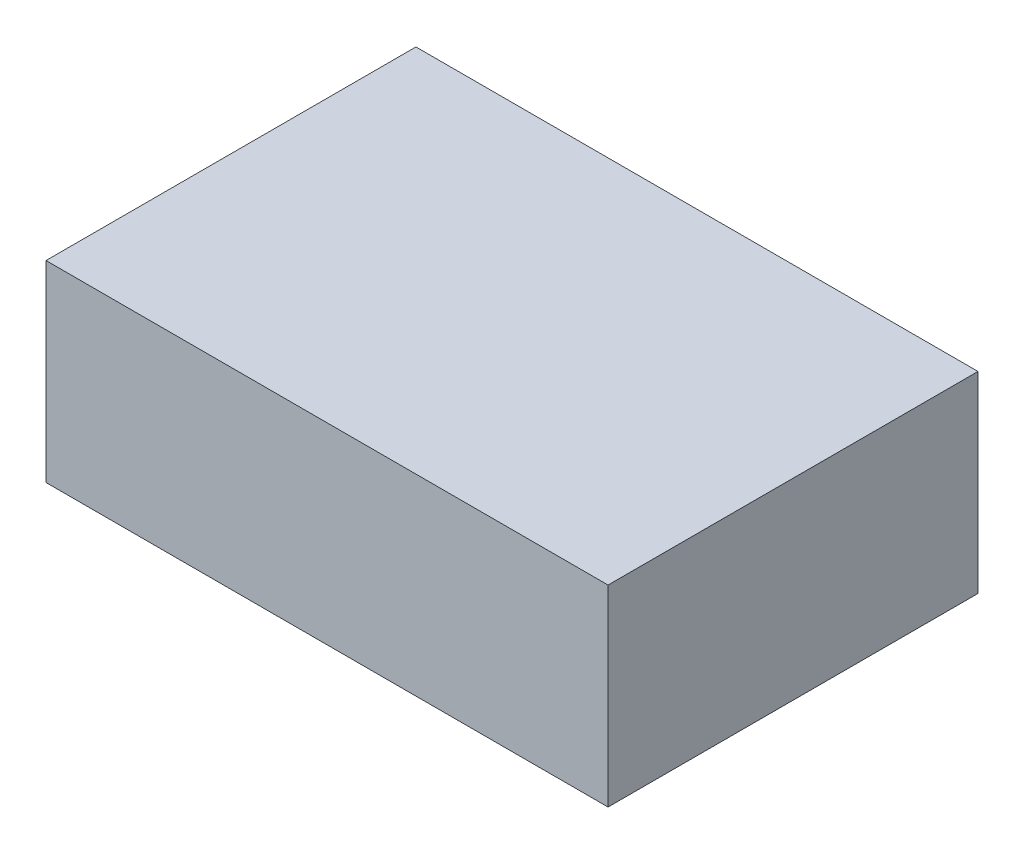
ISO-10303-21;
HEADER;
FILE_DESCRIPTION(('STEP AP214'),'2;1');
FILE_NAME('part.step','',(''),(''),'','','');
FILE_SCHEMA(('AUTOMOTIVE_DESIGN { 1 0 10303 214 1 1 1 1 }'));
ENDSEC;
DATA;
#1=APPLICATION_CONTEXT('core data for automotive mechanical design processes');
#2=APPLICATION_PROTOCOL_DEFINITION('international standard','automotive_design',2000,#1);
#3=PRODUCT_CONTEXT('',#1,'mechanical');
#4=PRODUCT('Part','Part','',(#3));
#5=PRODUCT_RELATED_PRODUCT_CATEGORY('part','',(#4));
#6=PRODUCT_DEFINITION_FORMATION('','',#4);
#7=PRODUCT_DEFINITION_CONTEXT('part definition',#1,'design');
#8=PRODUCT_DEFINITION('design','',#6,#7);
#9=PRODUCT_DEFINITION_SHAPE('','',#8);
#10=(LENGTH_UNIT() NAMED_UNIT(*) SI_UNIT(.MILLI.,.METRE.));
#11=(NAMED_UNIT(*) PLANE_ANGLE_UNIT() SI_UNIT($,.RADIAN.));
#12=(NAMED_UNIT(*) SI_UNIT($,.STERADIAN.) SOLID_ANGLE_UNIT());
#13=UNCERTAINTY_MEASURE_WITH_UNIT(LENGTH_MEASURE(1.E-05),#10,'distance_accuracy_value','');
#14=(GEOMETRIC_REPRESENTATION_CONTEXT(3) GLOBAL_UNCERTAINTY_ASSIGNED_CONTEXT((#13)) GLOBAL_UNIT_ASSIGNED_CONTEXT((#10,
#11,#12)) REPRESENTATION_CONTEXT('',''));
#15=CARTESIAN_POINT('',(0.,0.,0.));
#16=DIRECTION('',(0.,0.,1.));
#17=DIRECTION('',(1.,0.,0.));
#18=AXIS2_PLACEMENT_3D('',#15,#16,#17);
#19=CARTESIAN_POINT('',(0.,0.,0.));
#20=DIRECTION('',(0.,0.,1.));
#21=DIRECTION('',(1.,0.,0.));
#22=AXIS2_PLACEMENT_3D('',#19,#20,#21);
#23=PLANE('',#22);
#24=DIRECTION('',(-1.,0.,0.));
#25=VECTOR('',#24,1.);
#26=CARTESIAN_POINT('',(1.9304,-0.6604,0.));
#27=LINE('',#26,#25);
#28=CARTESIAN_POINT('',(1.9304,-0.6604,0.));
#29=VERTEX_POINT('',#28);
#30=CARTESIAN_POINT('',(-1.9304,-0.6604,0.));
#31=VERTEX_POINT('',#30);
#32=EDGE_CURVE('E27',#29,#31,#27,.T.);
#33=ORIENTED_EDGE('',*,*,#32,.T.);
#34=DIRECTION('',(0.,1.,0.));
#35=VECTOR('',#34,1.);
#36=CARTESIAN_POINT('',(-1.9304,-0.6604,0.));
#37=LINE('',#36,#35);
#38=CARTESIAN_POINT('',(-1.9304,0.6604,0.));
#39=VERTEX_POINT('',#38);
#40=EDGE_CURVE('E20',#31,#39,#37,.T.);
#41=ORIENTED_EDGE('',*,*,#40,.T.);
#42=DIRECTION('',(1.,0.,0.));
#43=VECTOR('',#42,1.);
#44=CARTESIAN_POINT('',(-1.9304,0.6604,0.));
#45=LINE('',#44,#43);
#46=CARTESIAN_POINT('',(1.9304,0.6604,0.));
#47=VERTEX_POINT('',#46);
#48=EDGE_CURVE('E67',#39,#47,#45,.T.);
#49=ORIENTED_EDGE('',*,*,#48,.T.);
#50=DIRECTION('',(0.,-1.,0.));
#51=VECTOR('',#50,1.);
#52=CARTESIAN_POINT('',(1.9304,0.6604,0.));
#53=LINE('',#52,#51);
#54=EDGE_CURVE('E76',#47,#29,#53,.T.);
#55=ORIENTED_EDGE('',*,*,#54,.T.);
#56=EDGE_LOOP('',(#33,#41,#49,#55));
#57=FACE_BOUND('',#56,.T.);
#58=ADVANCED_FACE('F16',(#57),#23,.F.);
#59=CARTESIAN_POINT('',(0.,0.,2.541));
#60=DIRECTION('',(0.,0.,1.));
#61=DIRECTION('',(1.,0.,0.));
#62=AXIS2_PLACEMENT_3D('',#59,#60,#61);
#63=PLANE('',#62);
#64=DIRECTION('',(1.,0.,0.));
#65=VECTOR('',#64,1.);
#66=CARTESIAN_POINT('',(1.9304,-0.6604,2.541));
#67=LINE('',#66,#65);
#68=CARTESIAN_POINT('',(-1.9304,-0.6604,2.541));
#69=VERTEX_POINT('',#68);
#70=CARTESIAN_POINT('',(1.9304,-0.6604,2.541));
#71=VERTEX_POINT('',#70);
#72=EDGE_CURVE('E11',#69,#71,#67,.T.);
#73=ORIENTED_EDGE('',*,*,#72,.T.);
#74=DIRECTION('',(0.,1.,0.));
#75=VECTOR('',#74,1.);
#76=CARTESIAN_POINT('',(1.9304,0.6604,2.541));
#77=LINE('',#76,#75);
#78=CARTESIAN_POINT('',(1.9304,0.6604,2.541));
#79=VERTEX_POINT('',#78);
#80=EDGE_CURVE('E80',#71,#79,#77,.T.);
#81=ORIENTED_EDGE('',*,*,#80,.T.);
#82=DIRECTION('',(-1.,0.,0.));
#83=VECTOR('',#82,1.);
#84=CARTESIAN_POINT('',(-1.9304,0.6604,2.541));
#85=LINE('',#84,#83);
#86=CARTESIAN_POINT('',(-1.9304,0.6604,2.541));
#87=VERTEX_POINT('',#86);
#88=EDGE_CURVE('E83',#79,#87,#85,.T.);
#89=ORIENTED_EDGE('',*,*,#88,.T.);
#90=DIRECTION('',(0.,-1.,0.));
#91=VECTOR('',#90,1.);
#92=CARTESIAN_POINT('',(-1.9304,-0.6604,2.541));
#93=LINE('',#92,#91);
#94=EDGE_CURVE('E110',#87,#69,#93,.T.);
#95=ORIENTED_EDGE('',*,*,#94,.T.);
#96=EDGE_LOOP('',(#73,#81,#89,#95));
#97=FACE_BOUND('',#96,.T.);
#98=ADVANCED_FACE('F81',(#97),#63,.T.);
#99=CARTESIAN_POINT('',(-1.9304,-0.6604,0.));
#100=DIRECTION('',(0.,-1.,0.));
#101=DIRECTION('',(-1.,0.,0.));
#102=AXIS2_PLACEMENT_3D('',#99,#100,#101);
#103=PLANE('',#102);
#104=ORIENTED_EDGE('',*,*,#32,.F.);
#105=DIRECTION('',(0.,0.,1.));
#106=VECTOR('',#105,1.);
#107=CARTESIAN_POINT('',(1.9304,-0.6604,0.));
#108=LINE('',#107,#106);
#109=EDGE_CURVE('E85',#29,#71,#108,.T.);
#110=ORIENTED_EDGE('',*,*,#109,.T.);
#111=ORIENTED_EDGE('',*,*,#72,.F.);
#112=DIRECTION('',(0.,0.,1.));
#113=VECTOR('',#112,1.);
#114=CARTESIAN_POINT('',(-1.9304,-0.6604,0.));
#115=LINE('',#114,#113);
#116=EDGE_CURVE('E106',#31,#69,#115,.T.);
#117=ORIENTED_EDGE('',*,*,#116,.F.);
#118=EDGE_LOOP('',(#104,#110,#111,#117));
#119=FACE_BOUND('',#118,.T.);
#120=ADVANCED_FACE('F120',(#119),#103,.T.);
#121=CARTESIAN_POINT('',(1.9304,-0.6604,0.));
#122=DIRECTION('',(1.,0.,0.));
#123=DIRECTION('',(0.,-1.,0.));
#124=AXIS2_PLACEMENT_3D('',#121,#122,#123);
#125=PLANE('',#124);
#126=ORIENTED_EDGE('',*,*,#54,.F.);
#127=DIRECTION('',(0.,0.,1.));
#128=VECTOR('',#127,1.);
#129=CARTESIAN_POINT('',(1.9304,0.6604,0.));
#130=LINE('',#129,#128);
#131=EDGE_CURVE('E86',#47,#79,#130,.T.);
#132=ORIENTED_EDGE('',*,*,#131,.T.);
#133=ORIENTED_EDGE('',*,*,#80,.F.);
#134=ORIENTED_EDGE('',*,*,#109,.F.);
#135=EDGE_LOOP('',(#126,#132,#133,#134));
#136=FACE_BOUND('',#135,.T.);
#137=ADVANCED_FACE('F18',(#136),#125,.T.);
#138=CARTESIAN_POINT('',(1.9304,0.6604,0.));
#139=DIRECTION('',(0.,1.,0.));
#140=DIRECTION('',(0.,0.,-1.));
#141=AXIS2_PLACEMENT_3D('',#138,#139,#140);
#142=PLANE('',#141);
#143=ORIENTED_EDGE('',*,*,#48,.F.);
#144=DIRECTION('',(0.,0.,1.));
#145=VECTOR('',#144,1.);
#146=CARTESIAN_POINT('',(-1.9304,0.6604,0.));
#147=LINE('',#146,#145);
#148=EDGE_CURVE('E90',#39,#87,#147,.T.);
#149=ORIENTED_EDGE('',*,*,#148,.T.);
#150=ORIENTED_EDGE('',*,*,#88,.F.);
#151=ORIENTED_EDGE('',*,*,#131,.F.);
#152=EDGE_LOOP('',(#143,#149,#150,#151));
#153=FACE_BOUND('',#152,.T.);
#154=ADVANCED_FACE('F89',(#153),#142,.T.);
#155=CARTESIAN_POINT('',(-1.9304,0.6604,0.));
#156=DIRECTION('',(-1.,0.,0.));
#157=DIRECTION('',(0.,0.,1.));
#158=AXIS2_PLACEMENT_3D('',#155,#156,#157);
#159=PLANE('',#158);
#160=ORIENTED_EDGE('',*,*,#40,.F.);
#161=ORIENTED_EDGE('',*,*,#116,.T.);
#162=ORIENTED_EDGE('',*,*,#94,.F.);
#163=ORIENTED_EDGE('',*,*,#148,.F.);
#164=EDGE_LOOP('',(#160,#161,#162,#163));
#165=FACE_BOUND('',#164,.T.);
#166=ADVANCED_FACE('F118',(#165),#159,.T.);
#167=CLOSED_SHELL('',(#58,#98,#120,#137,#154,#166));
#168=MANIFOLD_SOLID_BREP('B1',#167);
#169=ADVANCED_BREP_SHAPE_REPRESENTATION('',(#18,#168),#14);
#170=SHAPE_DEFINITION_REPRESENTATION(#9,#169);
ENDSEC;
END-ISO-10303-21;
